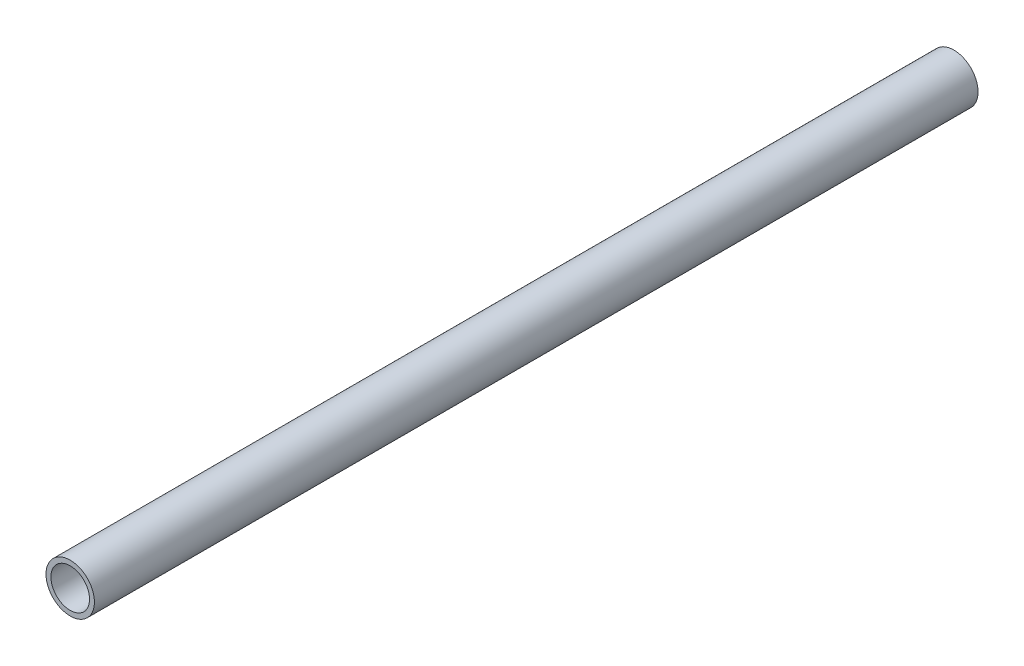
ISO-10303-21;
HEADER;
FILE_DESCRIPTION(('STEP AP214'),'2;1');
FILE_NAME('part.step','',(''),(''),'','','');
FILE_SCHEMA(('AUTOMOTIVE_DESIGN { 1 0 10303 214 1 1 1 1 }'));
ENDSEC;
DATA;
#1=APPLICATION_CONTEXT('core data for automotive mechanical design processes');
#2=APPLICATION_PROTOCOL_DEFINITION('international standard','automotive_design',2000,#1);
#3=PRODUCT_CONTEXT('',#1,'mechanical');
#4=PRODUCT('Part','Part','',(#3));
#5=PRODUCT_RELATED_PRODUCT_CATEGORY('part','',(#4));
#6=PRODUCT_DEFINITION_FORMATION('','',#4);
#7=PRODUCT_DEFINITION_CONTEXT('part definition',#1,'design');
#8=PRODUCT_DEFINITION('design','',#6,#7);
#9=PRODUCT_DEFINITION_SHAPE('','',#8);
#10=(LENGTH_UNIT() NAMED_UNIT(*) SI_UNIT(.MILLI.,.METRE.));
#11=(NAMED_UNIT(*) PLANE_ANGLE_UNIT() SI_UNIT($,.RADIAN.));
#12=(NAMED_UNIT(*) SI_UNIT($,.STERADIAN.) SOLID_ANGLE_UNIT());
#13=UNCERTAINTY_MEASURE_WITH_UNIT(LENGTH_MEASURE(1.E-05),#10,'distance_accuracy_value','');
#14=(GEOMETRIC_REPRESENTATION_CONTEXT(3) GLOBAL_UNCERTAINTY_ASSIGNED_CONTEXT((#13)) GLOBAL_UNIT_ASSIGNED_CONTEXT((#10,
#11,#12)) REPRESENTATION_CONTEXT('',''));
#15=CARTESIAN_POINT('',(0.,0.,0.));
#16=DIRECTION('',(0.,0.,1.));
#17=DIRECTION('',(1.,0.,0.));
#18=AXIS2_PLACEMENT_3D('',#15,#16,#17);
#19=CARTESIAN_POINT('',(0.,0.,609.6));
#20=DIRECTION('',(0.,0.,1.));
#21=DIRECTION('',(1.,0.,0.));
#22=AXIS2_PLACEMENT_3D('',#19,#20,#21);
#23=PLANE('',#22);
#24=CARTESIAN_POINT('',(0.,0.,609.6));
#25=DIRECTION('',(0.,0.,1.));
#26=DIRECTION('',(1.,0.,0.));
#27=AXIS2_PLACEMENT_3D('',#24,#25,#26);
#28=CIRCLE('',#27,16.7005);
#29=CARTESIAN_POINT('',(-16.7005,0.,609.6));
#30=VERTEX_POINT('',#29);
#31=EDGE_CURVE('E10',#30,#30,#28,.T.);
#32=ORIENTED_EDGE('',*,*,#31,.T.);
#33=EDGE_LOOP('',(#32));
#34=FACE_BOUND('',#33,.T.);
#35=CARTESIAN_POINT('',(0.,0.,609.6));
#36=DIRECTION('',(0.,0.,1.));
#37=DIRECTION('',(1.,0.,0.));
#38=AXIS2_PLACEMENT_3D('',#35,#36,#37);
#39=CIRCLE('',#38,13.3223);
#40=CARTESIAN_POINT('',(-13.3223,0.,609.6));
#41=VERTEX_POINT('',#40);
#42=EDGE_CURVE('E42',#41,#41,#39,.T.);
#43=ORIENTED_EDGE('',*,*,#42,.F.);
#44=EDGE_LOOP('',(#43));
#45=FACE_BOUND('',#44,.T.);
#46=ADVANCED_FACE('F31',(#34,#45),#23,.T.);
#47=CARTESIAN_POINT('',(0.,0.,0.));
#48=DIRECTION('',(0.,0.,1.));
#49=DIRECTION('',(1.,0.,0.));
#50=AXIS2_PLACEMENT_3D('',#47,#48,#49);
#51=PLANE('',#50);
#52=CARTESIAN_POINT('',(0.,0.,0.));
#53=DIRECTION('',(0.,0.,1.));
#54=DIRECTION('',(1.,0.,0.));
#55=AXIS2_PLACEMENT_3D('',#52,#53,#54);
#56=CIRCLE('',#55,16.7005);
#57=CARTESIAN_POINT('',(-16.7005,0.,0.));
#58=VERTEX_POINT('',#57);
#59=EDGE_CURVE('E35',#58,#58,#56,.T.);
#60=ORIENTED_EDGE('',*,*,#59,.F.);
#61=EDGE_LOOP('',(#60));
#62=FACE_BOUND('',#61,.T.);
#63=CARTESIAN_POINT('',(0.,0.,0.));
#64=DIRECTION('',(0.,0.,1.));
#65=DIRECTION('',(1.,0.,0.));
#66=AXIS2_PLACEMENT_3D('',#63,#64,#65);
#67=CIRCLE('',#66,13.3223);
#68=CARTESIAN_POINT('',(-13.3223,0.,0.));
#69=VERTEX_POINT('',#68);
#70=EDGE_CURVE('E44',#69,#69,#67,.T.);
#71=ORIENTED_EDGE('',*,*,#70,.T.);
#72=EDGE_LOOP('',(#71));
#73=FACE_BOUND('',#72,.T.);
#74=ADVANCED_FACE('F54',(#62,#73),#51,.F.);
#75=CARTESIAN_POINT('',(0.,0.,609.6));
#76=DIRECTION('',(0.,0.,-1.));
#77=DIRECTION('',(-1.,0.,0.));
#78=AXIS2_PLACEMENT_3D('',#75,#76,#77);
#79=CYLINDRICAL_SURFACE('',#78,16.7005);
#80=CARTESIAN_POINT('',(-16.7005,0.,609.6));
#81=CARTESIAN_POINT('',(-16.7005,0.,603.25));
#82=CARTESIAN_POINT('',(-16.7005,0.,596.9));
#83=CARTESIAN_POINT('',(-16.7005,0.,584.2));
#84=CARTESIAN_POINT('',(-16.7005,0.,577.85));
#85=CARTESIAN_POINT('',(-16.7005,0.,565.15));
#86=CARTESIAN_POINT('',(-16.7005,0.,558.8));
#87=CARTESIAN_POINT('',(-16.7005,0.,546.1));
#88=CARTESIAN_POINT('',(-16.7005,0.,539.75));
#89=CARTESIAN_POINT('',(-16.7005,0.,527.05));
#90=CARTESIAN_POINT('',(-16.7005,0.,520.7));
#91=CARTESIAN_POINT('',(-16.7005,0.,508.));
#92=CARTESIAN_POINT('',(-16.7005,0.,501.65));
#93=CARTESIAN_POINT('',(-16.7005,0.,488.95));
#94=CARTESIAN_POINT('',(-16.7005,0.,482.6));
#95=CARTESIAN_POINT('',(-16.7005,0.,469.9));
#96=CARTESIAN_POINT('',(-16.7005,0.,463.55));
#97=CARTESIAN_POINT('',(-16.7005,0.,450.85));
#98=CARTESIAN_POINT('',(-16.7005,0.,444.5));
#99=CARTESIAN_POINT('',(-16.7005,0.,431.8));
#100=CARTESIAN_POINT('',(-16.7005,0.,425.45));
#101=CARTESIAN_POINT('',(-16.7005,0.,412.75));
#102=CARTESIAN_POINT('',(-16.7005,0.,406.4));
#103=CARTESIAN_POINT('',(-16.7005,0.,393.7));
#104=CARTESIAN_POINT('',(-16.7005,0.,387.35));
#105=CARTESIAN_POINT('',(-16.7005,0.,374.65));
#106=CARTESIAN_POINT('',(-16.7005,0.,368.3));
#107=CARTESIAN_POINT('',(-16.7005,0.,355.6));
#108=CARTESIAN_POINT('',(-16.7005,0.,349.25));
#109=CARTESIAN_POINT('',(-16.7005,0.,336.55));
#110=CARTESIAN_POINT('',(-16.7005,0.,330.2));
#111=CARTESIAN_POINT('',(-16.7005,0.,317.5));
#112=CARTESIAN_POINT('',(-16.7005,0.,311.15));
#113=CARTESIAN_POINT('',(-16.7005,0.,298.45));
#114=CARTESIAN_POINT('',(-16.7005,0.,292.1));
#115=CARTESIAN_POINT('',(-16.7005,0.,279.4));
#116=CARTESIAN_POINT('',(-16.7005,0.,273.05));
#117=CARTESIAN_POINT('',(-16.7005,0.,260.35));
#118=CARTESIAN_POINT('',(-16.7005,0.,254.));
#119=CARTESIAN_POINT('',(-16.7005,0.,241.3));
#120=CARTESIAN_POINT('',(-16.7005,0.,234.95));
#121=CARTESIAN_POINT('',(-16.7005,0.,222.25));
#122=CARTESIAN_POINT('',(-16.7005,0.,215.9));
#123=CARTESIAN_POINT('',(-16.7005,0.,203.2));
#124=CARTESIAN_POINT('',(-16.7005,0.,196.85));
#125=CARTESIAN_POINT('',(-16.7005,0.,184.15));
#126=CARTESIAN_POINT('',(-16.7005,0.,177.8));
#127=CARTESIAN_POINT('',(-16.7005,0.,165.1));
#128=CARTESIAN_POINT('',(-16.7005,0.,158.75));
#129=CARTESIAN_POINT('',(-16.7005,0.,146.05));
#130=CARTESIAN_POINT('',(-16.7005,0.,139.7));
#131=CARTESIAN_POINT('',(-16.7005,0.,127.));
#132=CARTESIAN_POINT('',(-16.7005,0.,120.65));
#133=CARTESIAN_POINT('',(-16.7005,0.,107.95));
#134=CARTESIAN_POINT('',(-16.7005,0.,101.6));
#135=CARTESIAN_POINT('',(-16.7005,0.,88.9));
#136=CARTESIAN_POINT('',(-16.7005,0.,82.5500000000001));
#137=CARTESIAN_POINT('',(-16.7005,0.,69.85));
#138=CARTESIAN_POINT('',(-16.7005,0.,63.5));
#139=CARTESIAN_POINT('',(-16.7005,0.,50.8));
#140=CARTESIAN_POINT('',(-16.7005,0.,44.45));
#141=CARTESIAN_POINT('',(-16.7005,0.,31.75));
#142=CARTESIAN_POINT('',(-16.7005,0.,25.4));
#143=CARTESIAN_POINT('',(-16.7005,0.,12.7));
#144=CARTESIAN_POINT('',(-16.7005,0.,6.35000000000001));
#145=CARTESIAN_POINT('',(-16.7005,0.,0.));
#146=B_SPLINE_CURVE_WITH_KNOTS('',3,(#80,#81,#82,#83,#84,#85,#86,#87,#88,#89,#90,#91,#92,#93,
#94,#95,#96,#97,#98,#99,#100,#101,#102,#103,#104,#105,#106,#107,#108,#109,#110,#111,#112,#113,
#114,#115,#116,#117,#118,#119,#120,#121,#122,#123,#124,#125,#126,#127,#128,#129,#130,#131,#132,
#133,#134,#135,#136,#137,#138,#139,#140,#141,#142,#143,#144,#145),.UNSPECIFIED.,.F.,.F.,(4,2,2,
2,2,2,2,2,2,2,2,2,2,2,2,2,2,2,2,2,2,2,2,2,2,2,2,2,2,2,2,2,4),(0.,19.05,38.1,57.15,76.2,
95.2500000000001,114.3,133.35,152.4,171.45,190.5,209.55,228.6,247.65,266.7,285.75,304.8,323.85,
342.9,361.95,381.,400.05,419.1,438.15,457.2,476.25,495.3,514.35,533.4,552.45,571.5,590.55,
609.6),.UNSPECIFIED.);
#147=EDGE_CURVE('BSEAM33',#30,#58,#146,.T.);
#148=ORIENTED_EDGE('',*,*,#31,.F.);
#149=ORIENTED_EDGE('',*,*,#59,.T.);
#150=ORIENTED_EDGE('',*,*,#147,.T.);
#151=ORIENTED_EDGE('',*,*,#147,.F.);
#152=EDGE_LOOP('',(#148,#150,#149,#151));
#153=FACE_BOUND('',#152,.T.);
#154=ADVANCED_FACE('F33',(#153),#79,.T.);
#155=CARTESIAN_POINT('',(0.,0.,609.6));
#156=DIRECTION('',(0.,0.,-1.));
#157=DIRECTION('',(-1.,0.,0.));
#158=AXIS2_PLACEMENT_3D('',#155,#156,#157);
#159=CYLINDRICAL_SURFACE('',#158,13.3223);
#160=CARTESIAN_POINT('',(-13.3223,0.,609.6));
#161=CARTESIAN_POINT('',(-13.3223,0.,603.25));
#162=CARTESIAN_POINT('',(-13.3223,0.,596.9));
#163=CARTESIAN_POINT('',(-13.3223,0.,584.2));
#164=CARTESIAN_POINT('',(-13.3223,0.,577.85));
#165=CARTESIAN_POINT('',(-13.3223,0.,565.15));
#166=CARTESIAN_POINT('',(-13.3223,0.,558.8));
#167=CARTESIAN_POINT('',(-13.3223,0.,546.1));
#168=CARTESIAN_POINT('',(-13.3223,0.,539.75));
#169=CARTESIAN_POINT('',(-13.3223,0.,527.05));
#170=CARTESIAN_POINT('',(-13.3223,0.,520.7));
#171=CARTESIAN_POINT('',(-13.3223,0.,508.));
#172=CARTESIAN_POINT('',(-13.3223,0.,501.65));
#173=CARTESIAN_POINT('',(-13.3223,0.,488.95));
#174=CARTESIAN_POINT('',(-13.3223,0.,482.6));
#175=CARTESIAN_POINT('',(-13.3223,0.,469.9));
#176=CARTESIAN_POINT('',(-13.3223,0.,463.55));
#177=CARTESIAN_POINT('',(-13.3223,0.,450.85));
#178=CARTESIAN_POINT('',(-13.3223,0.,444.5));
#179=CARTESIAN_POINT('',(-13.3223,0.,431.8));
#180=CARTESIAN_POINT('',(-13.3223,0.,425.45));
#181=CARTESIAN_POINT('',(-13.3223,0.,412.75));
#182=CARTESIAN_POINT('',(-13.3223,0.,406.4));
#183=CARTESIAN_POINT('',(-13.3223,0.,393.7));
#184=CARTESIAN_POINT('',(-13.3223,0.,387.35));
#185=CARTESIAN_POINT('',(-13.3223,0.,374.65));
#186=CARTESIAN_POINT('',(-13.3223,0.,368.3));
#187=CARTESIAN_POINT('',(-13.3223,0.,355.6));
#188=CARTESIAN_POINT('',(-13.3223,0.,349.25));
#189=CARTESIAN_POINT('',(-13.3223,0.,336.55));
#190=CARTESIAN_POINT('',(-13.3223,0.,330.2));
#191=CARTESIAN_POINT('',(-13.3223,0.,317.5));
#192=CARTESIAN_POINT('',(-13.3223,0.,311.15));
#193=CARTESIAN_POINT('',(-13.3223,0.,298.45));
#194=CARTESIAN_POINT('',(-13.3223,0.,292.1));
#195=CARTESIAN_POINT('',(-13.3223,0.,279.4));
#196=CARTESIAN_POINT('',(-13.3223,0.,273.05));
#197=CARTESIAN_POINT('',(-13.3223,0.,260.35));
#198=CARTESIAN_POINT('',(-13.3223,0.,254.));
#199=CARTESIAN_POINT('',(-13.3223,0.,241.3));
#200=CARTESIAN_POINT('',(-13.3223,0.,234.95));
#201=CARTESIAN_POINT('',(-13.3223,0.,222.25));
#202=CARTESIAN_POINT('',(-13.3223,0.,215.9));
#203=CARTESIAN_POINT('',(-13.3223,0.,203.2));
#204=CARTESIAN_POINT('',(-13.3223,0.,196.85));
#205=CARTESIAN_POINT('',(-13.3223,0.,184.15));
#206=CARTESIAN_POINT('',(-13.3223,0.,177.8));
#207=CARTESIAN_POINT('',(-13.3223,0.,165.1));
#208=CARTESIAN_POINT('',(-13.3223,0.,158.75));
#209=CARTESIAN_POINT('',(-13.3223,0.,146.05));
#210=CARTESIAN_POINT('',(-13.3223,0.,139.7));
#211=CARTESIAN_POINT('',(-13.3223,0.,127.));
#212=CARTESIAN_POINT('',(-13.3223,0.,120.65));
#213=CARTESIAN_POINT('',(-13.3223,0.,107.95));
#214=CARTESIAN_POINT('',(-13.3223,0.,101.6));
#215=CARTESIAN_POINT('',(-13.3223,0.,88.9));
#216=CARTESIAN_POINT('',(-13.3223,0.,82.5500000000001));
#217=CARTESIAN_POINT('',(-13.3223,0.,69.85));
#218=CARTESIAN_POINT('',(-13.3223,0.,63.5));
#219=CARTESIAN_POINT('',(-13.3223,0.,50.8));
#220=CARTESIAN_POINT('',(-13.3223,0.,44.45));
#221=CARTESIAN_POINT('',(-13.3223,0.,31.75));
#222=CARTESIAN_POINT('',(-13.3223,0.,25.4));
#223=CARTESIAN_POINT('',(-13.3223,0.,12.7));
#224=CARTESIAN_POINT('',(-13.3223,0.,6.35000000000001));
#225=CARTESIAN_POINT('',(-13.3223,0.,0.));
#226=B_SPLINE_CURVE_WITH_KNOTS('',3,(#160,#161,#162,#163,#164,#165,#166,#167,#168,#169,#170,
#171,#172,#173,#174,#175,#176,#177,#178,#179,#180,#181,#182,#183,#184,#185,#186,#187,#188,#189,
#190,#191,#192,#193,#194,#195,#196,#197,#198,#199,#200,#201,#202,#203,#204,#205,#206,#207,#208,
#209,#210,#211,#212,#213,#214,#215,#216,#217,#218,#219,#220,#221,#222,#223,#224,#225),
.UNSPECIFIED.,.F.,.F.,(4,2,2,2,2,2,2,2,2,2,2,2,2,2,2,2,2,2,2,2,2,2,2,2,2,2,2,2,2,2,2,2,4),(0.,
19.0499999999999,38.0999999999999,57.1499999999999,76.1999999999999,95.2499999999999,114.3,
133.35,152.4,171.45,190.5,209.55,228.6,247.65,266.7,285.75,304.8,323.85,342.9,361.95,381.,
400.05,419.1,438.15,457.2,476.25,495.3,514.35,533.4,552.45,571.5,590.55,609.6),.UNSPECIFIED.);
#227=EDGE_CURVE('BSEAM50',#41,#69,#226,.T.);
#228=ORIENTED_EDGE('',*,*,#42,.T.);
#229=ORIENTED_EDGE('',*,*,#70,.F.);
#230=ORIENTED_EDGE('',*,*,#227,.T.);
#231=ORIENTED_EDGE('',*,*,#227,.F.);
#232=EDGE_LOOP('',(#228,#230,#229,#231));
#233=FACE_BOUND('',#232,.T.);
#234=ADVANCED_FACE('F50',(#233),#159,.F.);
#235=CLOSED_SHELL('',(#46,#74,#154,#234));
#236=MANIFOLD_SOLID_BREP('B2',#235);
#237=ADVANCED_BREP_SHAPE_REPRESENTATION('',(#18,#236),#14);
#238=SHAPE_DEFINITION_REPRESENTATION(#9,#237);
ENDSEC;
END-ISO-10303-21;
